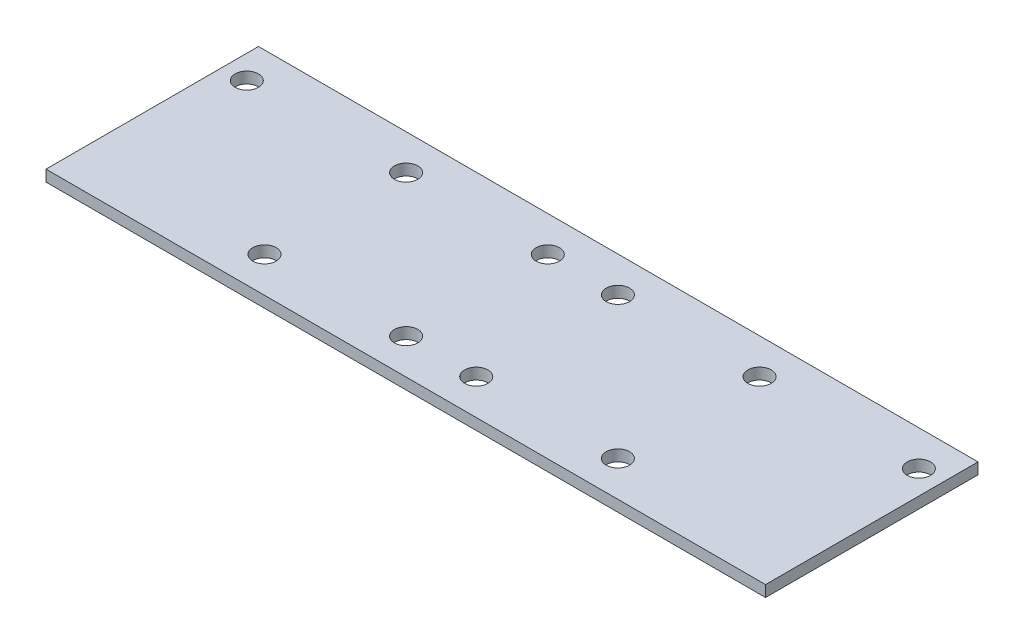
ISO-10303-21;
HEADER;
FILE_DESCRIPTION(('STEP AP214'),'2;1');
FILE_NAME('part.step','',(''),(''),'','','');
FILE_SCHEMA(('AUTOMOTIVE_DESIGN { 1 0 10303 214 1 1 1 1 }'));
ENDSEC;
DATA;
#1=APPLICATION_CONTEXT('core data for automotive mechanical design processes');
#2=APPLICATION_PROTOCOL_DEFINITION('international standard','automotive_design',2000,#1);
#3=PRODUCT_CONTEXT('',#1,'mechanical');
#4=PRODUCT('Part','Part','',(#3));
#5=PRODUCT_RELATED_PRODUCT_CATEGORY('part','',(#4));
#6=PRODUCT_DEFINITION_FORMATION('','',#4);
#7=PRODUCT_DEFINITION_CONTEXT('part definition',#1,'design');
#8=PRODUCT_DEFINITION('design','',#6,#7);
#9=PRODUCT_DEFINITION_SHAPE('','',#8);
#10=(LENGTH_UNIT() NAMED_UNIT(*) SI_UNIT(.MILLI.,.METRE.));
#11=(NAMED_UNIT(*) PLANE_ANGLE_UNIT() SI_UNIT($,.RADIAN.));
#12=(NAMED_UNIT(*) SI_UNIT($,.STERADIAN.) SOLID_ANGLE_UNIT());
#13=UNCERTAINTY_MEASURE_WITH_UNIT(LENGTH_MEASURE(1.E-05),#10,'distance_accuracy_value','');
#14=(GEOMETRIC_REPRESENTATION_CONTEXT(3) GLOBAL_UNCERTAINTY_ASSIGNED_CONTEXT((#13)) GLOBAL_UNIT_ASSIGNED_CONTEXT((#10,
#11,#12)) REPRESENTATION_CONTEXT('',''));
#15=CARTESIAN_POINT('',(0.,0.,0.));
#16=DIRECTION('',(0.,0.,1.));
#17=DIRECTION('',(1.,0.,0.));
#18=AXIS2_PLACEMENT_3D('',#15,#16,#17);
#19=CARTESIAN_POINT('',(0.,3.175,0.));
#20=DIRECTION('',(0.,1.,0.));
#21=DIRECTION('',(0.,0.,1.));
#22=AXIS2_PLACEMENT_3D('',#19,#20,#21);
#23=PLANE('',#22);
#24=CARTESIAN_POINT('',(9.90000000000002,3.175,-20.));
#25=DIRECTION('',(0.,1.,0.));
#26=DIRECTION('',(0.,0.,-1.));
#27=AXIS2_PLACEMENT_3D('',#24,#25,#26);
#28=CIRCLE('',#27,3.30000000000001);
#29=CARTESIAN_POINT('',(9.90000000000002,3.175,-23.3));
#30=VERTEX_POINT('',#29);
#31=EDGE_CURVE('E157',#30,#30,#28,.T.);
#32=ORIENTED_EDGE('',*,*,#31,.F.);
#33=EDGE_LOOP('',(#32));
#34=FACE_BOUND('',#33,.T.);
#35=CARTESIAN_POINT('',(49.9,3.175,20.));
#36=DIRECTION('',(0.,1.,0.));
#37=DIRECTION('',(0.,0.,1.));
#38=AXIS2_PLACEMENT_3D('',#35,#36,#37);
#39=CIRCLE('',#38,3.3);
#40=CARTESIAN_POINT('',(49.9,3.175,23.3));
#41=VERTEX_POINT('',#40);
#42=EDGE_CURVE('E145',#41,#41,#39,.T.);
#43=ORIENTED_EDGE('',*,*,#42,.F.);
#44=EDGE_LOOP('',(#43));
#45=FACE_BOUND('',#44,.T.);
#46=CARTESIAN_POINT('',(-94.9,3.175,-20.));
#47=DIRECTION('',(0.,1.,0.));
#48=DIRECTION('',(0.,0.,1.));
#49=AXIS2_PLACEMENT_3D('',#46,#47,#48);
#50=CIRCLE('',#49,3.29999999999999);
#51=CARTESIAN_POINT('',(-94.9,3.175,-16.7));
#52=VERTEX_POINT('',#51);
#53=EDGE_CURVE('E133',#52,#52,#50,.T.);
#54=ORIENTED_EDGE('',*,*,#53,.F.);
#55=EDGE_LOOP('',(#54));
#56=FACE_BOUND('',#55,.T.);
#57=CARTESIAN_POINT('',(-9.9,3.175,20.));
#58=DIRECTION('',(0.,1.,0.));
#59=DIRECTION('',(0.,0.,-1.));
#60=AXIS2_PLACEMENT_3D('',#57,#58,#59);
#61=CIRCLE('',#60,3.30000000000001);
#62=CARTESIAN_POINT('',(-9.9,3.175,16.7));
#63=VERTEX_POINT('',#62);
#64=EDGE_CURVE('E121',#63,#63,#61,.T.);
#65=ORIENTED_EDGE('',*,*,#64,.F.);
#66=EDGE_LOOP('',(#65));
#67=FACE_BOUND('',#66,.T.);
#68=CARTESIAN_POINT('',(-49.9,3.175,-20.));
#69=DIRECTION('',(0.,1.,0.));
#70=DIRECTION('',(0.,0.,1.));
#71=AXIS2_PLACEMENT_3D('',#68,#69,#70);
#72=CIRCLE('',#71,3.3);
#73=CARTESIAN_POINT('',(-49.9,3.175,-16.7));
#74=VERTEX_POINT('',#73);
#75=EDGE_CURVE('E100',#74,#74,#72,.T.);
#76=ORIENTED_EDGE('',*,*,#75,.F.);
#77=EDGE_LOOP('',(#76));
#78=FACE_BOUND('',#77,.T.);
#79=DIRECTION('',(0.,0.,-1.));
#80=VECTOR('',#79,1.);
#81=CARTESIAN_POINT('',(101.6,3.175,-30.));
#82=LINE('',#81,#80);
#83=CARTESIAN_POINT('',(101.6,3.175,30.));
#84=VERTEX_POINT('',#83);
#85=CARTESIAN_POINT('',(101.6,3.175,-30.));
#86=VERTEX_POINT('',#85);
#87=EDGE_CURVE('E85',#84,#86,#82,.T.);
#88=ORIENTED_EDGE('',*,*,#87,.T.);
#89=DIRECTION('',(-1.,0.,0.));
#90=VECTOR('',#89,1.);
#91=CARTESIAN_POINT('',(-101.6,3.175,-30.));
#92=LINE('',#91,#90);
#93=CARTESIAN_POINT('',(-101.6,3.175,-30.));
#94=VERTEX_POINT('',#93);
#95=EDGE_CURVE('E80',#86,#94,#92,.T.);
#96=ORIENTED_EDGE('',*,*,#95,.T.);
#97=DIRECTION('',(0.,0.,1.));
#98=VECTOR('',#97,1.);
#99=CARTESIAN_POINT('',(-101.6,3.175,-30.));
#100=LINE('',#99,#98);
#101=CARTESIAN_POINT('',(-101.6,3.175,30.));
#102=VERTEX_POINT('',#101);
#103=EDGE_CURVE('E83',#94,#102,#100,.T.);
#104=ORIENTED_EDGE('',*,*,#103,.T.);
#105=DIRECTION('',(1.,0.,0.));
#106=VECTOR('',#105,1.);
#107=CARTESIAN_POINT('',(-101.6,3.175,30.));
#108=LINE('',#107,#106);
#109=EDGE_CURVE('E50',#102,#84,#108,.T.);
#110=ORIENTED_EDGE('',*,*,#109,.T.);
#111=EDGE_LOOP('',(#88,#96,#104,#110));
#112=FACE_BOUND('',#111,.T.);
#113=CARTESIAN_POINT('',(-9.9,3.175,-20.));
#114=DIRECTION('',(0.,1.,0.));
#115=DIRECTION('',(0.,0.,1.));
#116=AXIS2_PLACEMENT_3D('',#113,#114,#115);
#117=CIRCLE('',#116,3.30000000000001);
#118=CARTESIAN_POINT('',(-9.9,3.175,-16.7));
#119=VERTEX_POINT('',#118);
#120=EDGE_CURVE('E115',#119,#119,#117,.T.);
#121=ORIENTED_EDGE('',*,*,#120,.F.);
#122=EDGE_LOOP('',(#121));
#123=FACE_BOUND('',#122,.T.);
#124=CARTESIAN_POINT('',(-49.9,3.175,20.));
#125=DIRECTION('',(0.,1.,0.));
#126=DIRECTION('',(0.,0.,-1.));
#127=AXIS2_PLACEMENT_3D('',#124,#125,#126);
#128=CIRCLE('',#127,3.3);
#129=CARTESIAN_POINT('',(-49.9,3.175,16.7));
#130=VERTEX_POINT('',#129);
#131=EDGE_CURVE('E127',#130,#130,#128,.T.);
#132=ORIENTED_EDGE('',*,*,#131,.F.);
#133=EDGE_LOOP('',(#132));
#134=FACE_BOUND('',#133,.T.);
#135=CARTESIAN_POINT('',(94.9,3.175,-20.));
#136=DIRECTION('',(0.,1.,0.));
#137=DIRECTION('',(0.,0.,-1.));
#138=AXIS2_PLACEMENT_3D('',#135,#136,#137);
#139=CIRCLE('',#138,3.29999999999999);
#140=CARTESIAN_POINT('',(94.9,3.175,-23.3));
#141=VERTEX_POINT('',#140);
#142=EDGE_CURVE('E139',#141,#141,#139,.T.);
#143=ORIENTED_EDGE('',*,*,#142,.F.);
#144=EDGE_LOOP('',(#143));
#145=FACE_BOUND('',#144,.T.);
#146=CARTESIAN_POINT('',(9.90000000000002,3.175,20.));
#147=DIRECTION('',(0.,1.,0.));
#148=DIRECTION('',(0.,0.,1.));
#149=AXIS2_PLACEMENT_3D('',#146,#147,#148);
#150=CIRCLE('',#149,3.30000000000001);
#151=CARTESIAN_POINT('',(9.90000000000002,3.175,23.3));
#152=VERTEX_POINT('',#151);
#153=EDGE_CURVE('E151',#152,#152,#150,.T.);
#154=ORIENTED_EDGE('',*,*,#153,.F.);
#155=EDGE_LOOP('',(#154));
#156=FACE_BOUND('',#155,.T.);
#157=CARTESIAN_POINT('',(49.9,3.175,-20.));
#158=DIRECTION('',(0.,1.,0.));
#159=DIRECTION('',(0.,0.,-1.));
#160=AXIS2_PLACEMENT_3D('',#157,#158,#159);
#161=CIRCLE('',#160,3.3);
#162=CARTESIAN_POINT('',(49.9,3.175,-23.3));
#163=VERTEX_POINT('',#162);
#164=EDGE_CURVE('E163',#163,#163,#161,.T.);
#165=ORIENTED_EDGE('',*,*,#164,.F.);
#166=EDGE_LOOP('',(#165));
#167=FACE_BOUND('',#166,.T.);
#168=ADVANCED_FACE('F33',(#34,#45,#56,#67,#78,#112,#123,#134,#145,#156,#167),#23,.T.);
#169=CARTESIAN_POINT('',(0.,0.,0.));
#170=DIRECTION('',(0.,1.,0.));
#171=DIRECTION('',(0.,0.,1.));
#172=AXIS2_PLACEMENT_3D('',#169,#170,#171);
#173=PLANE('',#172);
#174=DIRECTION('',(0.,0.,-1.));
#175=VECTOR('',#174,1.);
#176=CARTESIAN_POINT('',(101.6,0.,-30.));
#177=LINE('',#176,#175);
#178=CARTESIAN_POINT('',(101.6,0.,30.));
#179=VERTEX_POINT('',#178);
#180=CARTESIAN_POINT('',(101.6,0.,-30.));
#181=VERTEX_POINT('',#180);
#182=EDGE_CURVE('E97',#179,#181,#177,.T.);
#183=ORIENTED_EDGE('',*,*,#182,.F.);
#184=DIRECTION('',(1.,0.,0.));
#185=VECTOR('',#184,1.);
#186=CARTESIAN_POINT('',(-101.6,0.,30.));
#187=LINE('',#186,#185);
#188=CARTESIAN_POINT('',(-101.6,0.,30.));
#189=VERTEX_POINT('',#188);
#190=EDGE_CURVE('E73',#189,#179,#187,.T.);
#191=ORIENTED_EDGE('',*,*,#190,.F.);
#192=DIRECTION('',(0.,0.,1.));
#193=VECTOR('',#192,1.);
#194=CARTESIAN_POINT('',(-101.6,0.,-30.));
#195=LINE('',#194,#193);
#196=CARTESIAN_POINT('',(-101.6,0.,-30.));
#197=VERTEX_POINT('',#196);
#198=EDGE_CURVE('E67',#197,#189,#195,.T.);
#199=ORIENTED_EDGE('',*,*,#198,.F.);
#200=DIRECTION('',(-1.,0.,0.));
#201=VECTOR('',#200,1.);
#202=CARTESIAN_POINT('',(-101.6,0.,-30.));
#203=LINE('',#202,#201);
#204=EDGE_CURVE('E89',#181,#197,#203,.T.);
#205=ORIENTED_EDGE('',*,*,#204,.F.);
#206=EDGE_LOOP('',(#183,#191,#199,#205));
#207=FACE_BOUND('',#206,.T.);
#208=CARTESIAN_POINT('',(-49.9,0.,-20.));
#209=DIRECTION('',(0.,1.,0.));
#210=DIRECTION('',(0.,0.,1.));
#211=AXIS2_PLACEMENT_3D('',#208,#209,#210);
#212=CIRCLE('',#211,3.3);
#213=CARTESIAN_POINT('',(-49.9,0.,-16.7));
#214=VERTEX_POINT('',#213);
#215=EDGE_CURVE('E112',#214,#214,#212,.T.);
#216=ORIENTED_EDGE('',*,*,#215,.T.);
#217=EDGE_LOOP('',(#216));
#218=FACE_BOUND('',#217,.T.);
#219=CARTESIAN_POINT('',(-9.9,0.,-20.));
#220=DIRECTION('',(0.,1.,0.));
#221=DIRECTION('',(0.,0.,1.));
#222=AXIS2_PLACEMENT_3D('',#219,#220,#221);
#223=CIRCLE('',#222,3.30000000000001);
#224=CARTESIAN_POINT('',(-9.9,0.,-16.7));
#225=VERTEX_POINT('',#224);
#226=EDGE_CURVE('E118',#225,#225,#223,.T.);
#227=ORIENTED_EDGE('',*,*,#226,.T.);
#228=EDGE_LOOP('',(#227));
#229=FACE_BOUND('',#228,.T.);
#230=CARTESIAN_POINT('',(-9.9,0.,20.));
#231=DIRECTION('',(0.,1.,0.));
#232=DIRECTION('',(0.,0.,-1.));
#233=AXIS2_PLACEMENT_3D('',#230,#231,#232);
#234=CIRCLE('',#233,3.30000000000001);
#235=CARTESIAN_POINT('',(-9.9,0.,16.7));
#236=VERTEX_POINT('',#235);
#237=EDGE_CURVE('E124',#236,#236,#234,.T.);
#238=ORIENTED_EDGE('',*,*,#237,.T.);
#239=EDGE_LOOP('',(#238));
#240=FACE_BOUND('',#239,.T.);
#241=CARTESIAN_POINT('',(-49.9,0.,20.));
#242=DIRECTION('',(0.,1.,0.));
#243=DIRECTION('',(0.,0.,-1.));
#244=AXIS2_PLACEMENT_3D('',#241,#242,#243);
#245=CIRCLE('',#244,3.3);
#246=CARTESIAN_POINT('',(-49.9,0.,16.7));
#247=VERTEX_POINT('',#246);
#248=EDGE_CURVE('E130',#247,#247,#245,.T.);
#249=ORIENTED_EDGE('',*,*,#248,.T.);
#250=EDGE_LOOP('',(#249));
#251=FACE_BOUND('',#250,.T.);
#252=CARTESIAN_POINT('',(-94.9,0.,-20.));
#253=DIRECTION('',(0.,1.,0.));
#254=DIRECTION('',(0.,0.,1.));
#255=AXIS2_PLACEMENT_3D('',#252,#253,#254);
#256=CIRCLE('',#255,3.29999999999999);
#257=CARTESIAN_POINT('',(-94.9,0.,-16.7));
#258=VERTEX_POINT('',#257);
#259=EDGE_CURVE('E136',#258,#258,#256,.T.);
#260=ORIENTED_EDGE('',*,*,#259,.T.);
#261=EDGE_LOOP('',(#260));
#262=FACE_BOUND('',#261,.T.);
#263=CARTESIAN_POINT('',(94.9,0.,-20.));
#264=DIRECTION('',(0.,1.,0.));
#265=DIRECTION('',(0.,0.,-1.));
#266=AXIS2_PLACEMENT_3D('',#263,#264,#265);
#267=CIRCLE('',#266,3.29999999999999);
#268=CARTESIAN_POINT('',(94.9,0.,-23.3));
#269=VERTEX_POINT('',#268);
#270=EDGE_CURVE('E142',#269,#269,#267,.T.);
#271=ORIENTED_EDGE('',*,*,#270,.T.);
#272=EDGE_LOOP('',(#271));
#273=FACE_BOUND('',#272,.T.);
#274=CARTESIAN_POINT('',(49.9,0.,20.));
#275=DIRECTION('',(0.,1.,0.));
#276=DIRECTION('',(0.,0.,1.));
#277=AXIS2_PLACEMENT_3D('',#274,#275,#276);
#278=CIRCLE('',#277,3.3);
#279=CARTESIAN_POINT('',(49.9,0.,23.3));
#280=VERTEX_POINT('',#279);
#281=EDGE_CURVE('E148',#280,#280,#278,.T.);
#282=ORIENTED_EDGE('',*,*,#281,.T.);
#283=EDGE_LOOP('',(#282));
#284=FACE_BOUND('',#283,.T.);
#285=CARTESIAN_POINT('',(9.90000000000002,0.,20.));
#286=DIRECTION('',(0.,1.,0.));
#287=DIRECTION('',(0.,0.,1.));
#288=AXIS2_PLACEMENT_3D('',#285,#286,#287);
#289=CIRCLE('',#288,3.30000000000001);
#290=CARTESIAN_POINT('',(9.90000000000002,0.,23.3));
#291=VERTEX_POINT('',#290);
#292=EDGE_CURVE('E154',#291,#291,#289,.T.);
#293=ORIENTED_EDGE('',*,*,#292,.T.);
#294=EDGE_LOOP('',(#293));
#295=FACE_BOUND('',#294,.T.);
#296=CARTESIAN_POINT('',(9.90000000000002,0.,-20.));
#297=DIRECTION('',(0.,1.,0.));
#298=DIRECTION('',(0.,0.,-1.));
#299=AXIS2_PLACEMENT_3D('',#296,#297,#298);
#300=CIRCLE('',#299,3.30000000000001);
#301=CARTESIAN_POINT('',(9.90000000000002,0.,-23.3));
#302=VERTEX_POINT('',#301);
#303=EDGE_CURVE('E160',#302,#302,#300,.T.);
#304=ORIENTED_EDGE('',*,*,#303,.T.);
#305=EDGE_LOOP('',(#304));
#306=FACE_BOUND('',#305,.T.);
#307=CARTESIAN_POINT('',(49.9,0.,-20.));
#308=DIRECTION('',(0.,1.,0.));
#309=DIRECTION('',(0.,0.,-1.));
#310=AXIS2_PLACEMENT_3D('',#307,#308,#309);
#311=CIRCLE('',#310,3.3);
#312=CARTESIAN_POINT('',(49.9,0.,-23.3));
#313=VERTEX_POINT('',#312);
#314=EDGE_CURVE('E166',#313,#313,#311,.T.);
#315=ORIENTED_EDGE('',*,*,#314,.T.);
#316=EDGE_LOOP('',(#315));
#317=FACE_BOUND('',#316,.T.);
#318=ADVANCED_FACE('F108',(#207,#218,#229,#240,#251,#262,#273,#284,#295,#306,#317),#173,.F.);
#319=CARTESIAN_POINT('',(101.6,3.175,-30.));
#320=DIRECTION('',(-1.,0.,0.));
#321=DIRECTION('',(0.,0.,1.));
#322=AXIS2_PLACEMENT_3D('',#319,#320,#321);
#323=PLANE('',#322);
#324=ORIENTED_EDGE('',*,*,#182,.T.);
#325=DIRECTION('',(0.,-1.,0.));
#326=VECTOR('',#325,1.);
#327=CARTESIAN_POINT('',(101.6,3.175,-30.));
#328=LINE('',#327,#326);
#329=EDGE_CURVE('E11',#86,#181,#328,.T.);
#330=ORIENTED_EDGE('',*,*,#329,.F.);
#331=ORIENTED_EDGE('',*,*,#87,.F.);
#332=DIRECTION('',(0.,-1.,0.));
#333=VECTOR('',#332,1.);
#334=CARTESIAN_POINT('',(101.6,3.175,30.));
#335=LINE('',#334,#333);
#336=EDGE_CURVE('E93',#84,#179,#335,.T.);
#337=ORIENTED_EDGE('',*,*,#336,.T.);
#338=EDGE_LOOP('',(#324,#330,#331,#337));
#339=FACE_BOUND('',#338,.T.);
#340=ADVANCED_FACE('F35',(#339),#323,.F.);
#341=CARTESIAN_POINT('',(-101.6,3.175,-30.));
#342=DIRECTION('',(0.,0.,1.));
#343=DIRECTION('',(1.,0.,0.));
#344=AXIS2_PLACEMENT_3D('',#341,#342,#343);
#345=PLANE('',#344);
#346=ORIENTED_EDGE('',*,*,#204,.T.);
#347=DIRECTION('',(0.,-1.,0.));
#348=VECTOR('',#347,1.);
#349=CARTESIAN_POINT('',(-101.6,3.175,-30.));
#350=LINE('',#349,#348);
#351=EDGE_CURVE('E42',#94,#197,#350,.T.);
#352=ORIENTED_EDGE('',*,*,#351,.F.);
#353=ORIENTED_EDGE('',*,*,#95,.F.);
#354=ORIENTED_EDGE('',*,*,#329,.T.);
#355=EDGE_LOOP('',(#346,#352,#353,#354));
#356=FACE_BOUND('',#355,.T.);
#357=ADVANCED_FACE('F88',(#356),#345,.F.);
#358=CARTESIAN_POINT('',(-101.6,3.175,-30.));
#359=DIRECTION('',(1.,0.,0.));
#360=DIRECTION('',(0.,0.,-1.));
#361=AXIS2_PLACEMENT_3D('',#358,#359,#360);
#362=PLANE('',#361);
#363=ORIENTED_EDGE('',*,*,#198,.T.);
#364=DIRECTION('',(0.,-1.,0.));
#365=VECTOR('',#364,1.);
#366=CARTESIAN_POINT('',(-101.6,3.175,30.));
#367=LINE('',#366,#365);
#368=EDGE_CURVE('E90',#102,#189,#367,.T.);
#369=ORIENTED_EDGE('',*,*,#368,.F.);
#370=ORIENTED_EDGE('',*,*,#103,.F.);
#371=ORIENTED_EDGE('',*,*,#351,.T.);
#372=EDGE_LOOP('',(#363,#369,#370,#371));
#373=FACE_BOUND('',#372,.T.);
#374=ADVANCED_FACE('F91',(#373),#362,.F.);
#375=CARTESIAN_POINT('',(-101.6,3.175,30.));
#376=DIRECTION('',(0.,0.,-1.));
#377=DIRECTION('',(-1.,0.,0.));
#378=AXIS2_PLACEMENT_3D('',#375,#376,#377);
#379=PLANE('',#378);
#380=ORIENTED_EDGE('',*,*,#190,.T.);
#381=ORIENTED_EDGE('',*,*,#336,.F.);
#382=ORIENTED_EDGE('',*,*,#109,.F.);
#383=ORIENTED_EDGE('',*,*,#368,.T.);
#384=EDGE_LOOP('',(#380,#381,#382,#383));
#385=FACE_BOUND('',#384,.T.);
#386=ADVANCED_FACE('F105',(#385),#379,.F.);
#387=CARTESIAN_POINT('',(-49.9,3.175,-20.));
#388=DIRECTION('',(0.,-1.,0.));
#389=DIRECTION('',(0.,0.,-1.));
#390=AXIS2_PLACEMENT_3D('',#387,#388,#389);
#391=CYLINDRICAL_SURFACE('',#390,3.3);
#392=ORIENTED_EDGE('',*,*,#75,.T.);
#393=EDGE_LOOP('',(#392));
#394=FACE_BOUND('',#393,.T.);
#395=ORIENTED_EDGE('',*,*,#215,.F.);
#396=EDGE_LOOP('',(#395));
#397=FACE_BOUND('',#396,.T.);
#398=ADVANCED_FACE('F185',(#394,#397),#391,.F.);
#399=CARTESIAN_POINT('',(-9.9,3.175,-20.));
#400=DIRECTION('',(0.,-1.,0.));
#401=DIRECTION('',(0.,0.,-1.));
#402=AXIS2_PLACEMENT_3D('',#399,#400,#401);
#403=CYLINDRICAL_SURFACE('',#402,3.30000000000001);
#404=ORIENTED_EDGE('',*,*,#120,.T.);
#405=EDGE_LOOP('',(#404));
#406=FACE_BOUND('',#405,.T.);
#407=ORIENTED_EDGE('',*,*,#226,.F.);
#408=EDGE_LOOP('',(#407));
#409=FACE_BOUND('',#408,.T.);
#410=ADVANCED_FACE('F231',(#406,#409),#403,.F.);
#411=CARTESIAN_POINT('',(-9.9,3.175,20.));
#412=DIRECTION('',(0.,-1.,0.));
#413=DIRECTION('',(0.,0.,-1.));
#414=AXIS2_PLACEMENT_3D('',#411,#412,#413);
#415=CYLINDRICAL_SURFACE('',#414,3.30000000000001);
#416=ORIENTED_EDGE('',*,*,#64,.T.);
#417=EDGE_LOOP('',(#416));
#418=FACE_BOUND('',#417,.T.);
#419=ORIENTED_EDGE('',*,*,#237,.F.);
#420=EDGE_LOOP('',(#419));
#421=FACE_BOUND('',#420,.T.);
#422=ADVANCED_FACE('F239',(#418,#421),#415,.F.);
#423=CARTESIAN_POINT('',(-49.9,3.175,20.));
#424=DIRECTION('',(0.,-1.,0.));
#425=DIRECTION('',(0.,0.,-1.));
#426=AXIS2_PLACEMENT_3D('',#423,#424,#425);
#427=CYLINDRICAL_SURFACE('',#426,3.3);
#428=ORIENTED_EDGE('',*,*,#131,.T.);
#429=EDGE_LOOP('',(#428));
#430=FACE_BOUND('',#429,.T.);
#431=ORIENTED_EDGE('',*,*,#248,.F.);
#432=EDGE_LOOP('',(#431));
#433=FACE_BOUND('',#432,.T.);
#434=ADVANCED_FACE('F247',(#430,#433),#427,.F.);
#435=CARTESIAN_POINT('',(-94.9,3.175,-20.));
#436=DIRECTION('',(0.,-1.,0.));
#437=DIRECTION('',(0.,0.,-1.));
#438=AXIS2_PLACEMENT_3D('',#435,#436,#437);
#439=CYLINDRICAL_SURFACE('',#438,3.29999999999999);
#440=ORIENTED_EDGE('',*,*,#53,.T.);
#441=EDGE_LOOP('',(#440));
#442=FACE_BOUND('',#441,.T.);
#443=ORIENTED_EDGE('',*,*,#259,.F.);
#444=EDGE_LOOP('',(#443));
#445=FACE_BOUND('',#444,.T.);
#446=ADVANCED_FACE('F256',(#442,#445),#439,.F.);
#447=CARTESIAN_POINT('',(94.9,3.175,-20.));
#448=DIRECTION('',(0.,-1.,0.));
#449=DIRECTION('',(0.,0.,-1.));
#450=AXIS2_PLACEMENT_3D('',#447,#448,#449);
#451=CYLINDRICAL_SURFACE('',#450,3.29999999999999);
#452=ORIENTED_EDGE('',*,*,#142,.T.);
#453=EDGE_LOOP('',(#452));
#454=FACE_BOUND('',#453,.T.);
#455=ORIENTED_EDGE('',*,*,#270,.F.);
#456=EDGE_LOOP('',(#455));
#457=FACE_BOUND('',#456,.T.);
#458=ADVANCED_FACE('F265',(#454,#457),#451,.F.);
#459=CARTESIAN_POINT('',(49.9,3.175,20.));
#460=DIRECTION('',(0.,-1.,0.));
#461=DIRECTION('',(0.,0.,-1.));
#462=AXIS2_PLACEMENT_3D('',#459,#460,#461);
#463=CYLINDRICAL_SURFACE('',#462,3.3);
#464=ORIENTED_EDGE('',*,*,#42,.T.);
#465=EDGE_LOOP('',(#464));
#466=FACE_BOUND('',#465,.T.);
#467=ORIENTED_EDGE('',*,*,#281,.F.);
#468=EDGE_LOOP('',(#467));
#469=FACE_BOUND('',#468,.T.);
#470=ADVANCED_FACE('F274',(#466,#469),#463,.F.);
#471=CARTESIAN_POINT('',(9.90000000000002,3.175,20.));
#472=DIRECTION('',(0.,-1.,0.));
#473=DIRECTION('',(0.,0.,-1.));
#474=AXIS2_PLACEMENT_3D('',#471,#472,#473);
#475=CYLINDRICAL_SURFACE('',#474,3.30000000000001);
#476=ORIENTED_EDGE('',*,*,#153,.T.);
#477=EDGE_LOOP('',(#476));
#478=FACE_BOUND('',#477,.T.);
#479=ORIENTED_EDGE('',*,*,#292,.F.);
#480=EDGE_LOOP('',(#479));
#481=FACE_BOUND('',#480,.T.);
#482=ADVANCED_FACE('F283',(#478,#481),#475,.F.);
#483=CARTESIAN_POINT('',(9.90000000000002,3.175,-20.));
#484=DIRECTION('',(0.,-1.,0.));
#485=DIRECTION('',(0.,0.,-1.));
#486=AXIS2_PLACEMENT_3D('',#483,#484,#485);
#487=CYLINDRICAL_SURFACE('',#486,3.30000000000001);
#488=ORIENTED_EDGE('',*,*,#31,.T.);
#489=EDGE_LOOP('',(#488));
#490=FACE_BOUND('',#489,.T.);
#491=ORIENTED_EDGE('',*,*,#303,.F.);
#492=EDGE_LOOP('',(#491));
#493=FACE_BOUND('',#492,.T.);
#494=ADVANCED_FACE('F292',(#490,#493),#487,.F.);
#495=CARTESIAN_POINT('',(49.9,3.175,-20.));
#496=DIRECTION('',(0.,-1.,0.));
#497=DIRECTION('',(0.,0.,-1.));
#498=AXIS2_PLACEMENT_3D('',#495,#496,#497);
#499=CYLINDRICAL_SURFACE('',#498,3.3);
#500=ORIENTED_EDGE('',*,*,#164,.T.);
#501=EDGE_LOOP('',(#500));
#502=FACE_BOUND('',#501,.T.);
#503=ORIENTED_EDGE('',*,*,#314,.F.);
#504=EDGE_LOOP('',(#503));
#505=FACE_BOUND('',#504,.T.);
#506=ADVANCED_FACE('F172',(#502,#505),#499,.F.);
#507=CLOSED_SHELL('',(#168,#318,#340,#357,#374,#386,#398,#410,#422,#434,#446,#458,#470,#482,
#494,#506));
#508=MANIFOLD_SOLID_BREP('B2',#507);
#509=ADVANCED_BREP_SHAPE_REPRESENTATION('',(#18,#508),#14);
#510=SHAPE_DEFINITION_REPRESENTATION(#9,#509);
ENDSEC;
END-ISO-10303-21;
